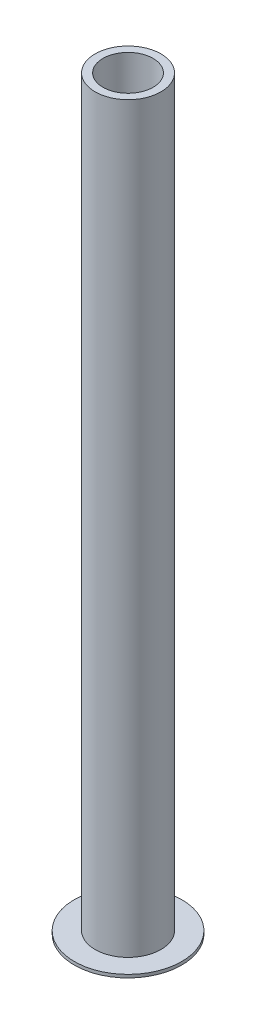
ISO-10303-21;
HEADER;
FILE_DESCRIPTION(('STEP AP214'),'2;1');
FILE_NAME('part.step','',(''),(''),'','','');
FILE_SCHEMA(('AUTOMOTIVE_DESIGN { 1 0 10303 214 1 1 1 1 }'));
ENDSEC;
DATA;
#1=APPLICATION_CONTEXT('core data for automotive mechanical design processes');
#2=APPLICATION_PROTOCOL_DEFINITION('international standard','automotive_design',2000,#1);
#3=PRODUCT_CONTEXT('',#1,'mechanical');
#4=PRODUCT('Part','Part','',(#3));
#5=PRODUCT_RELATED_PRODUCT_CATEGORY('part','',(#4));
#6=PRODUCT_DEFINITION_FORMATION('','',#4);
#7=PRODUCT_DEFINITION_CONTEXT('part definition',#1,'design');
#8=PRODUCT_DEFINITION('design','',#6,#7);
#9=PRODUCT_DEFINITION_SHAPE('','',#8);
#10=(LENGTH_UNIT() NAMED_UNIT(*) SI_UNIT(.MILLI.,.METRE.));
#11=(NAMED_UNIT(*) PLANE_ANGLE_UNIT() SI_UNIT($,.RADIAN.));
#12=(NAMED_UNIT(*) SI_UNIT($,.STERADIAN.) SOLID_ANGLE_UNIT());
#13=UNCERTAINTY_MEASURE_WITH_UNIT(LENGTH_MEASURE(1.E-05),#10,'distance_accuracy_value','');
#14=(GEOMETRIC_REPRESENTATION_CONTEXT(3) GLOBAL_UNCERTAINTY_ASSIGNED_CONTEXT((#13)) GLOBAL_UNIT_ASSIGNED_CONTEXT((#10,
#11,#12)) REPRESENTATION_CONTEXT('',''));
#15=CARTESIAN_POINT('',(0.,0.,0.));
#16=DIRECTION('',(0.,0.,1.));
#17=DIRECTION('',(1.,0.,0.));
#18=AXIS2_PLACEMENT_3D('',#15,#16,#17);
#19=CARTESIAN_POINT('',(0.,120.396,0.));
#20=DIRECTION('',(0.,1.,0.));
#21=DIRECTION('',(0.,0.,1.));
#22=AXIS2_PLACEMENT_3D('',#19,#20,#21);
#23=PLANE('',#22);
#24=CARTESIAN_POINT('',(0.,120.396,0.));
#25=DIRECTION('',(0.,1.,0.));
#26=DIRECTION('',(0.,0.,1.));
#27=AXIS2_PLACEMENT_3D('',#24,#25,#26);
#28=CIRCLE('',#27,5.334);
#29=CARTESIAN_POINT('',(0.,120.396,-5.334));
#30=VERTEX_POINT('',#29);
#31=EDGE_CURVE('E10',#30,#30,#28,.T.);
#32=ORIENTED_EDGE('',*,*,#31,.T.);
#33=EDGE_LOOP('',(#32));
#34=FACE_BOUND('',#33,.T.);
#35=CARTESIAN_POINT('',(0.,120.396,0.));
#36=DIRECTION('',(0.,1.,0.));
#37=DIRECTION('',(0.,0.,1.));
#38=AXIS2_PLACEMENT_3D('',#35,#36,#37);
#39=CIRCLE('',#38,4.064);
#40=CARTESIAN_POINT('',(0.,120.396,-4.064));
#41=VERTEX_POINT('',#40);
#42=EDGE_CURVE('E43',#41,#41,#39,.T.);
#43=ORIENTED_EDGE('',*,*,#42,.F.);
#44=EDGE_LOOP('',(#43));
#45=FACE_BOUND('',#44,.T.);
#46=ADVANCED_FACE('F35',(#34,#45),#23,.T.);
#47=CARTESIAN_POINT('',(0.,120.396,0.));
#48=DIRECTION('',(0.,-1.,0.));
#49=DIRECTION('',(0.,0.,-1.));
#50=AXIS2_PLACEMENT_3D('',#47,#48,#49);
#51=CYLINDRICAL_SURFACE('',#50,5.334);
#52=CARTESIAN_POINT('',(0.,0.,0.));
#53=DIRECTION('',(0.,1.,0.));
#54=DIRECTION('',(0.,0.,1.));
#55=AXIS2_PLACEMENT_3D('',#52,#53,#54);
#56=CIRCLE('',#55,5.334);
#57=CARTESIAN_POINT('',(0.,0.,-5.334));
#58=VERTEX_POINT('',#57);
#59=EDGE_CURVE('E39',#58,#58,#56,.T.);
#60=CARTESIAN_POINT('',(0.,120.396,-5.334));
#61=CARTESIAN_POINT('',(0.,119.141875,-5.334));
#62=CARTESIAN_POINT('',(0.,117.88775,-5.334));
#63=CARTESIAN_POINT('',(0.,115.3795,-5.334));
#64=CARTESIAN_POINT('',(0.,114.125375,-5.334));
#65=CARTESIAN_POINT('',(0.,111.617125,-5.334));
#66=CARTESIAN_POINT('',(0.,110.363,-5.334));
#67=CARTESIAN_POINT('',(0.,107.85475,-5.334));
#68=CARTESIAN_POINT('',(0.,106.600625,-5.334));
#69=CARTESIAN_POINT('',(0.,104.092375,-5.334));
#70=CARTESIAN_POINT('',(0.,102.83825,-5.334));
#71=CARTESIAN_POINT('',(0.,100.33,-5.334));
#72=CARTESIAN_POINT('',(0.,99.075875,-5.334));
#73=CARTESIAN_POINT('',(0.,96.567625,-5.334));
#74=CARTESIAN_POINT('',(0.,95.3135,-5.334));
#75=CARTESIAN_POINT('',(0.,92.80525,-5.334));
#76=CARTESIAN_POINT('',(0.,91.551125,-5.334));
#77=CARTESIAN_POINT('',(0.,89.042875,-5.334));
#78=CARTESIAN_POINT('',(0.,87.78875,-5.334));
#79=CARTESIAN_POINT('',(0.,85.2805,-5.334));
#80=CARTESIAN_POINT('',(0.,84.026375,-5.334));
#81=CARTESIAN_POINT('',(0.,81.518125,-5.334));
#82=CARTESIAN_POINT('',(0.,80.264,-5.334));
#83=CARTESIAN_POINT('',(0.,77.75575,-5.334));
#84=CARTESIAN_POINT('',(0.,76.501625,-5.334));
#85=CARTESIAN_POINT('',(0.,73.993375,-5.334));
#86=CARTESIAN_POINT('',(0.,72.73925,-5.334));
#87=CARTESIAN_POINT('',(0.,70.231,-5.334));
#88=CARTESIAN_POINT('',(0.,68.976875,-5.334));
#89=CARTESIAN_POINT('',(0.,66.468625,-5.334));
#90=CARTESIAN_POINT('',(0.,65.2145,-5.334));
#91=CARTESIAN_POINT('',(0.,62.70625,-5.334));
#92=CARTESIAN_POINT('',(0.,61.452125,-5.334));
#93=CARTESIAN_POINT('',(0.,58.943875,-5.334));
#94=CARTESIAN_POINT('',(0.,57.68975,-5.334));
#95=CARTESIAN_POINT('',(0.,55.1815,-5.334));
#96=CARTESIAN_POINT('',(0.,53.927375,-5.334));
#97=CARTESIAN_POINT('',(0.,51.419125,-5.334));
#98=CARTESIAN_POINT('',(0.,50.165,-5.334));
#99=CARTESIAN_POINT('',(0.,47.65675,-5.334));
#100=CARTESIAN_POINT('',(0.,46.402625,-5.334));
#101=CARTESIAN_POINT('',(0.,43.894375,-5.334));
#102=CARTESIAN_POINT('',(0.,42.64025,-5.334));
#103=CARTESIAN_POINT('',(0.,40.132,-5.334));
#104=CARTESIAN_POINT('',(0.,38.877875,-5.334));
#105=CARTESIAN_POINT('',(0.,36.369625,-5.334));
#106=CARTESIAN_POINT('',(0.,35.1155,-5.334));
#107=CARTESIAN_POINT('',(0.,32.60725,-5.334));
#108=CARTESIAN_POINT('',(0.,31.353125,-5.334));
#109=CARTESIAN_POINT('',(0.,28.844875,-5.334));
#110=CARTESIAN_POINT('',(0.,27.59075,-5.334));
#111=CARTESIAN_POINT('',(0.,25.0825,-5.334));
#112=CARTESIAN_POINT('',(0.,23.828375,-5.334));
#113=CARTESIAN_POINT('',(0.,21.320125,-5.334));
#114=CARTESIAN_POINT('',(0.,20.066,-5.334));
#115=CARTESIAN_POINT('',(0.,17.55775,-5.334));
#116=CARTESIAN_POINT('',(0.,16.303625,-5.334));
#117=CARTESIAN_POINT('',(0.,13.795375,-5.334));
#118=CARTESIAN_POINT('',(0.,12.54125,-5.334));
#119=CARTESIAN_POINT('',(0.,10.033,-5.334));
#120=CARTESIAN_POINT('',(0.,8.77887499999998,-5.334));
#121=CARTESIAN_POINT('',(0.,6.27062499999998,-5.334));
#122=CARTESIAN_POINT('',(0.,5.01649999999998,-5.334));
#123=CARTESIAN_POINT('',(0.,2.50824999999998,-5.334));
#124=CARTESIAN_POINT('',(0.,1.25412499999998,-5.334));
#125=CARTESIAN_POINT('',(0.,0.,-5.334));
#126=B_SPLINE_CURVE_WITH_KNOTS('',3,(#60,#61,#62,#63,#64,#65,#66,#67,#68,#69,#70,#71,#72,#73,
#74,#75,#76,#77,#78,#79,#80,#81,#82,#83,#84,#85,#86,#87,#88,#89,#90,#91,#92,#93,#94,#95,#96,#97,
#98,#99,#100,#101,#102,#103,#104,#105,#106,#107,#108,#109,#110,#111,#112,#113,#114,#115,#116,
#117,#118,#119,#120,#121,#122,#123,#124,#125),.UNSPECIFIED.,.F.,.F.,(4,2,2,2,2,2,2,2,2,2,2,2,2,
2,2,2,2,2,2,2,2,2,2,2,2,2,2,2,2,2,2,2,4),(0.,3.762375,7.52475,11.287125,15.0495,18.811875,
22.57425,26.336625,30.099,33.861375,37.62375,41.386125,45.1485,48.910875,52.67325,56.435625,
60.198,63.960375,67.72275,71.485125,75.2475,79.009875,82.77225,86.534625,90.297,94.059375,
97.82175,101.584125,105.3465,109.108875,112.87125,116.633625,120.396),.UNSPECIFIED.);
#127=EDGE_CURVE('BSEAM37',#30,#58,#126,.T.);
#128=ORIENTED_EDGE('',*,*,#31,.F.);
#129=ORIENTED_EDGE('',*,*,#59,.T.);
#130=ORIENTED_EDGE('',*,*,#127,.T.);
#131=ORIENTED_EDGE('',*,*,#127,.F.);
#132=EDGE_LOOP('',(#128,#130,#129,#131));
#133=FACE_BOUND('',#132,.T.);
#134=ADVANCED_FACE('F37',(#133),#51,.T.);
#135=CARTESIAN_POINT('',(0.,120.396,0.));
#136=DIRECTION('',(0.,-1.,0.));
#137=DIRECTION('',(0.,0.,-1.));
#138=AXIS2_PLACEMENT_3D('',#135,#136,#137);
#139=CYLINDRICAL_SURFACE('',#138,4.064);
#140=CARTESIAN_POINT('',(0.,-0.508,0.));
#141=DIRECTION('',(0.,-1.,0.));
#142=DIRECTION('',(0.,0.,-1.));
#143=AXIS2_PLACEMENT_3D('',#140,#141,#142);
#144=CIRCLE('',#143,4.064);
#145=CARTESIAN_POINT('',(0.,-0.507999999999995,-4.064));
#146=VERTEX_POINT('',#145);
#147=EDGE_CURVE('E53',#146,#146,#144,.T.);
#148=CARTESIAN_POINT('',(0.,120.396,-4.064));
#149=CARTESIAN_POINT('',(0.,119.136583333333,-4.064));
#150=CARTESIAN_POINT('',(0.,117.877166666667,-4.064));
#151=CARTESIAN_POINT('',(0.,115.358333333333,-4.064));
#152=CARTESIAN_POINT('',(0.,114.098916666667,-4.064));
#153=CARTESIAN_POINT('',(0.,111.580083333333,-4.064));
#154=CARTESIAN_POINT('',(0.,110.320666666667,-4.064));
#155=CARTESIAN_POINT('',(0.,107.801833333333,-4.064));
#156=CARTESIAN_POINT('',(0.,106.542416666667,-4.064));
#157=CARTESIAN_POINT('',(0.,104.023583333333,-4.064));
#158=CARTESIAN_POINT('',(0.,102.764166666667,-4.064));
#159=CARTESIAN_POINT('',(0.,100.245333333333,-4.064));
#160=CARTESIAN_POINT('',(0.,98.9859166666667,-4.064));
#161=CARTESIAN_POINT('',(0.,96.4670833333333,-4.064));
#162=CARTESIAN_POINT('',(0.,95.2076666666667,-4.064));
#163=CARTESIAN_POINT('',(0.,92.6888333333333,-4.064));
#164=CARTESIAN_POINT('',(0.,91.4294166666667,-4.064));
#165=CARTESIAN_POINT('',(0.,88.9105833333333,-4.064));
#166=CARTESIAN_POINT('',(0.,87.6511666666667,-4.064));
#167=CARTESIAN_POINT('',(0.,85.1323333333333,-4.064));
#168=CARTESIAN_POINT('',(0.,83.8729166666667,-4.064));
#169=CARTESIAN_POINT('',(0.,81.3540833333333,-4.064));
#170=CARTESIAN_POINT('',(0.,80.0946666666667,-4.064));
#171=CARTESIAN_POINT('',(0.,77.5758333333333,-4.064));
#172=CARTESIAN_POINT('',(0.,76.3164166666667,-4.064));
#173=CARTESIAN_POINT('',(0.,73.7975833333333,-4.064));
#174=CARTESIAN_POINT('',(0.,72.5381666666667,-4.064));
#175=CARTESIAN_POINT('',(0.,70.0193333333333,-4.064));
#176=CARTESIAN_POINT('',(0.,68.7599166666667,-4.064));
#177=CARTESIAN_POINT('',(0.,66.2410833333333,-4.064));
#178=CARTESIAN_POINT('',(0.,64.9816666666667,-4.064));
#179=CARTESIAN_POINT('',(0.,62.4628333333333,-4.064));
#180=CARTESIAN_POINT('',(0.,61.2034166666667,-4.064));
#181=CARTESIAN_POINT('',(0.,58.6845833333333,-4.064));
#182=CARTESIAN_POINT('',(0.,57.4251666666667,-4.064));
#183=CARTESIAN_POINT('',(0.,54.9063333333333,-4.064));
#184=CARTESIAN_POINT('',(0.,53.6469166666667,-4.064));
#185=CARTESIAN_POINT('',(0.,51.1280833333333,-4.064));
#186=CARTESIAN_POINT('',(0.,49.8686666666667,-4.064));
#187=CARTESIAN_POINT('',(0.,47.3498333333333,-4.064));
#188=CARTESIAN_POINT('',(0.,46.0904166666667,-4.064));
#189=CARTESIAN_POINT('',(0.,43.5715833333333,-4.064));
#190=CARTESIAN_POINT('',(0.,42.3121666666667,-4.064));
#191=CARTESIAN_POINT('',(0.,39.7933333333333,-4.064));
#192=CARTESIAN_POINT('',(0.,38.5339166666667,-4.064));
#193=CARTESIAN_POINT('',(0.,36.0150833333333,-4.064));
#194=CARTESIAN_POINT('',(0.,34.7556666666667,-4.064));
#195=CARTESIAN_POINT('',(0.,32.2368333333333,-4.064));
#196=CARTESIAN_POINT('',(0.,30.9774166666667,-4.064));
#197=CARTESIAN_POINT('',(0.,28.4585833333333,-4.064));
#198=CARTESIAN_POINT('',(0.,27.1991666666667,-4.064));
#199=CARTESIAN_POINT('',(0.,24.6803333333333,-4.064));
#200=CARTESIAN_POINT('',(0.,23.4209166666667,-4.064));
#201=CARTESIAN_POINT('',(0.,20.9020833333333,-4.064));
#202=CARTESIAN_POINT('',(0.,19.6426666666667,-4.064));
#203=CARTESIAN_POINT('',(0.,17.1238333333333,-4.064));
#204=CARTESIAN_POINT('',(0.,15.8644166666667,-4.064));
#205=CARTESIAN_POINT('',(0.,13.3455833333333,-4.064));
#206=CARTESIAN_POINT('',(0.,12.0861666666667,-4.064));
#207=CARTESIAN_POINT('',(0.,9.56733333333334,-4.064));
#208=CARTESIAN_POINT('',(0.,8.30791666666667,-4.064));
#209=CARTESIAN_POINT('',(0.,5.78908333333333,-4.064));
#210=CARTESIAN_POINT('',(0.,4.52966666666667,-4.064));
#211=CARTESIAN_POINT('',(0.,2.01083333333334,-4.064));
#212=CARTESIAN_POINT('',(0.,0.75141666666667,-4.064));
#213=CARTESIAN_POINT('',(0.,-0.507999999999995,-4.064));
#214=B_SPLINE_CURVE_WITH_KNOTS('',3,(#148,#149,#150,#151,#152,#153,#154,#155,#156,#157,#158,
#159,#160,#161,#162,#163,#164,#165,#166,#167,#168,#169,#170,#171,#172,#173,#174,#175,#176,#177,
#178,#179,#180,#181,#182,#183,#184,#185,#186,#187,#188,#189,#190,#191,#192,#193,#194,#195,#196,
#197,#198,#199,#200,#201,#202,#203,#204,#205,#206,#207,#208,#209,#210,#211,#212,#213),
.UNSPECIFIED.,.F.,.F.,(4,2,2,2,2,2,2,2,2,2,2,2,2,2,2,2,2,2,2,2,2,2,2,2,2,2,2,2,2,2,2,2,4),(0.,
3.77825,7.55649999999999,11.33475,15.113,18.89125,22.6695,26.44775,30.226,34.00425,37.7825,
41.56075,45.339,49.11725,52.8955,56.67375,60.452,64.23025,68.0085,71.78675,75.565,79.34325,
83.1215,86.89975,90.678,94.45625,98.2345,102.01275,105.791,109.56925,113.3475,117.12575,
120.904),.UNSPECIFIED.);
#215=EDGE_CURVE('BSEAM59',#41,#146,#214,.T.);
#216=ORIENTED_EDGE('',*,*,#42,.T.);
#217=ORIENTED_EDGE('',*,*,#147,.T.);
#218=ORIENTED_EDGE('',*,*,#215,.T.);
#219=ORIENTED_EDGE('',*,*,#215,.F.);
#220=EDGE_LOOP('',(#216,#218,#217,#219));
#221=FACE_BOUND('',#220,.T.);
#222=ADVANCED_FACE('F59',(#221),#139,.F.);
#223=CARTESIAN_POINT('',(0.,-0.508,0.));
#224=DIRECTION('',(0.,-1.,0.));
#225=DIRECTION('',(0.,0.,-1.));
#226=AXIS2_PLACEMENT_3D('',#223,#224,#225);
#227=PLANE('',#226);
#228=CARTESIAN_POINT('',(0.,-0.508,0.));
#229=DIRECTION('',(0.,-1.,0.));
#230=DIRECTION('',(0.,0.,-1.));
#231=AXIS2_PLACEMENT_3D('',#228,#229,#230);
#232=CIRCLE('',#231,8.6995);
#233=CARTESIAN_POINT('',(0.,-0.508,-8.6995));
#234=VERTEX_POINT('',#233);
#235=EDGE_CURVE('E52',#234,#234,#232,.T.);
#236=ORIENTED_EDGE('',*,*,#235,.T.);
#237=EDGE_LOOP('',(#236));
#238=FACE_BOUND('',#237,.T.);
#239=ORIENTED_EDGE('',*,*,#147,.F.);
#240=EDGE_LOOP('',(#239));
#241=FACE_BOUND('',#240,.T.);
#242=ADVANCED_FACE('F61',(#238,#241),#227,.T.);
#243=CARTESIAN_POINT('',(0.,0.,0.));
#244=DIRECTION('',(0.,-1.,0.));
#245=DIRECTION('',(0.,0.,-1.));
#246=AXIS2_PLACEMENT_3D('',#243,#244,#245);
#247=PLANE('',#246);
#248=ORIENTED_EDGE('',*,*,#59,.F.);
#249=EDGE_LOOP('',(#248));
#250=FACE_BOUND('',#249,.T.);
#251=CARTESIAN_POINT('',(0.,0.,0.));
#252=DIRECTION('',(0.,-1.,0.));
#253=DIRECTION('',(0.,0.,-1.));
#254=AXIS2_PLACEMENT_3D('',#251,#252,#253);
#255=CIRCLE('',#254,8.6995);
#256=CARTESIAN_POINT('',(0.,0.,-8.6995));
#257=VERTEX_POINT('',#256);
#258=EDGE_CURVE('E49',#257,#257,#255,.T.);
#259=ORIENTED_EDGE('',*,*,#258,.F.);
#260=EDGE_LOOP('',(#259));
#261=FACE_BOUND('',#260,.T.);
#262=ADVANCED_FACE('F63',(#250,#261),#247,.F.);
#263=CARTESIAN_POINT('',(0.,-0.508,0.));
#264=DIRECTION('',(0.,1.,0.));
#265=DIRECTION('',(0.,0.,1.));
#266=AXIS2_PLACEMENT_3D('',#263,#264,#265);
#267=CYLINDRICAL_SURFACE('',#266,8.6995);
#268=ORIENTED_EDGE('',*,*,#235,.F.);
#269=EDGE_LOOP('',(#268));
#270=FACE_BOUND('',#269,.T.);
#271=ORIENTED_EDGE('',*,*,#258,.T.);
#272=EDGE_LOOP('',(#271));
#273=FACE_BOUND('',#272,.T.);
#274=ADVANCED_FACE('F70',(#270,#273),#267,.T.);
#275=CLOSED_SHELL('',(#46,#134,#222,#242,#262,#274));
#276=MANIFOLD_SOLID_BREP('B2',#275);
#277=ADVANCED_BREP_SHAPE_REPRESENTATION('',(#18,#276),#14);
#278=SHAPE_DEFINITION_REPRESENTATION(#9,#277);
ENDSEC;
END-ISO-10303-21;
